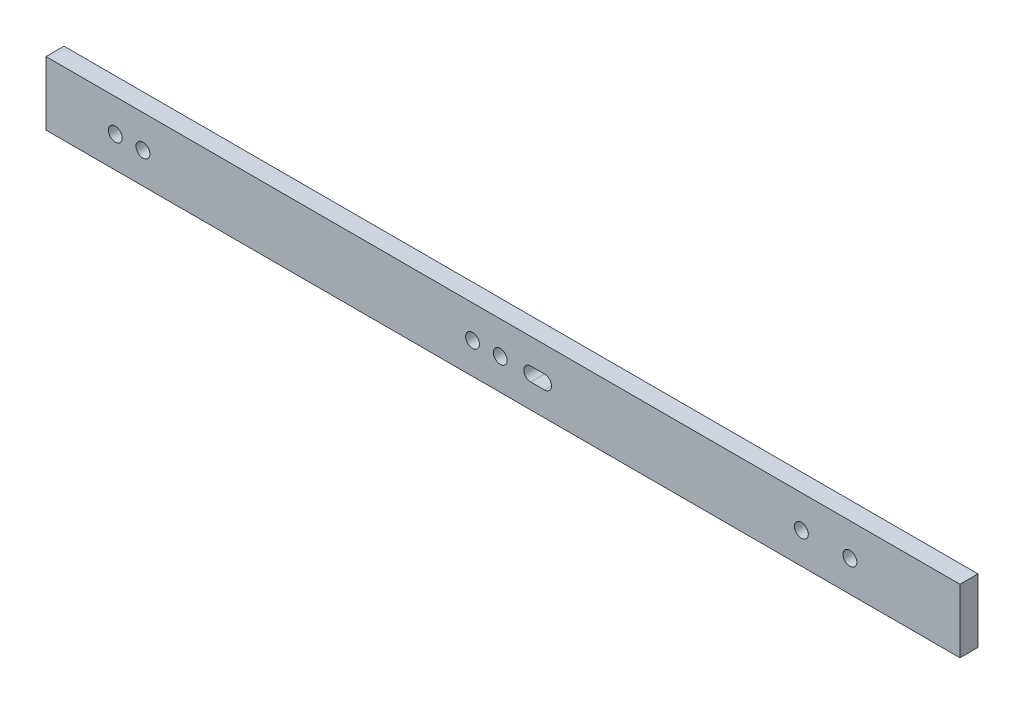
ISO-10303-21;
HEADER;
FILE_DESCRIPTION(('STEP AP214'),'2;1');
FILE_NAME('part.step','',(''),(''),'','','');
FILE_SCHEMA(('AUTOMOTIVE_DESIGN { 1 0 10303 214 1 1 1 1 }'));
ENDSEC;
DATA;
#1=APPLICATION_CONTEXT('core data for automotive mechanical design processes');
#2=APPLICATION_PROTOCOL_DEFINITION('international standard','automotive_design',2000,#1);
#3=PRODUCT_CONTEXT('',#1,'mechanical');
#4=PRODUCT('Part','Part','',(#3));
#5=PRODUCT_RELATED_PRODUCT_CATEGORY('part','',(#4));
#6=PRODUCT_DEFINITION_FORMATION('','',#4);
#7=PRODUCT_DEFINITION_CONTEXT('part definition',#1,'design');
#8=PRODUCT_DEFINITION('design','',#6,#7);
#9=PRODUCT_DEFINITION_SHAPE('','',#8);
#10=(LENGTH_UNIT() NAMED_UNIT(*) SI_UNIT(.MILLI.,.METRE.));
#11=(NAMED_UNIT(*) PLANE_ANGLE_UNIT() SI_UNIT($,.RADIAN.));
#12=(NAMED_UNIT(*) SI_UNIT($,.STERADIAN.) SOLID_ANGLE_UNIT());
#13=UNCERTAINTY_MEASURE_WITH_UNIT(LENGTH_MEASURE(1.E-05),#10,'distance_accuracy_value','');
#14=(GEOMETRIC_REPRESENTATION_CONTEXT(3) GLOBAL_UNCERTAINTY_ASSIGNED_CONTEXT((#13)) GLOBAL_UNIT_ASSIGNED_CONTEXT((#10,
#11,#12)) REPRESENTATION_CONTEXT('',''));
#15=CARTESIAN_POINT('',(0.,0.,0.));
#16=DIRECTION('',(0.,0.,1.));
#17=DIRECTION('',(1.,0.,0.));
#18=AXIS2_PLACEMENT_3D('',#15,#16,#17);
#19=CARTESIAN_POINT('',(330.,0.,0.));
#20=DIRECTION('',(1.,0.,0.));
#21=DIRECTION('',(0.,0.,-1.));
#22=AXIS2_PLACEMENT_3D('',#19,#20,#21);
#23=PLANE('',#22);
#24=DIRECTION('',(0.,1.,0.));
#25=VECTOR('',#24,1.);
#26=CARTESIAN_POINT('',(330.,0.,6.5));
#27=LINE('',#26,#25);
#28=CARTESIAN_POINT('',(330.,0.,6.5));
#29=VERTEX_POINT('',#28);
#30=CARTESIAN_POINT('',(330.,23.,6.5));
#31=VERTEX_POINT('',#30);
#32=EDGE_CURVE('E162',#29,#31,#27,.T.);
#33=ORIENTED_EDGE('',*,*,#32,.F.);
#34=DIRECTION('',(0.,0.,1.));
#35=VECTOR('',#34,1.);
#36=CARTESIAN_POINT('',(330.,0.,0.));
#37=LINE('',#36,#35);
#38=CARTESIAN_POINT('',(330.,0.,0.));
#39=VERTEX_POINT('',#38);
#40=EDGE_CURVE('E11',#39,#29,#37,.T.);
#41=ORIENTED_EDGE('',*,*,#40,.F.);
#42=DIRECTION('',(0.,1.,0.));
#43=VECTOR('',#42,1.);
#44=CARTESIAN_POINT('',(330.,0.,0.));
#45=LINE('',#44,#43);
#46=CARTESIAN_POINT('',(330.,23.,0.));
#47=VERTEX_POINT('',#46);
#48=EDGE_CURVE('E165',#39,#47,#45,.T.);
#49=ORIENTED_EDGE('',*,*,#48,.T.);
#50=DIRECTION('',(0.,0.,1.));
#51=VECTOR('',#50,1.);
#52=CARTESIAN_POINT('',(330.,23.,0.));
#53=LINE('',#52,#51);
#54=EDGE_CURVE('E38',#47,#31,#53,.T.);
#55=ORIENTED_EDGE('',*,*,#54,.T.);
#56=EDGE_LOOP('',(#33,#41,#49,#55));
#57=FACE_BOUND('',#56,.T.);
#58=ADVANCED_FACE('F35',(#57),#23,.T.);
#59=CARTESIAN_POINT('',(0.,0.,0.));
#60=DIRECTION('',(0.,-1.,0.));
#61=DIRECTION('',(0.,0.,-1.));
#62=AXIS2_PLACEMENT_3D('',#59,#60,#61);
#63=PLANE('',#62);
#64=DIRECTION('',(1.,0.,0.));
#65=VECTOR('',#64,1.);
#66=CARTESIAN_POINT('',(0.,0.,6.5));
#67=LINE('',#66,#65);
#68=CARTESIAN_POINT('',(0.,0.,6.5));
#69=VERTEX_POINT('',#68);
#70=EDGE_CURVE('E169',#69,#29,#67,.T.);
#71=ORIENTED_EDGE('',*,*,#70,.F.);
#72=DIRECTION('',(0.,0.,1.));
#73=VECTOR('',#72,1.);
#74=CARTESIAN_POINT('',(0.,0.,0.));
#75=LINE('',#74,#73);
#76=CARTESIAN_POINT('',(0.,0.,0.));
#77=VERTEX_POINT('',#76);
#78=EDGE_CURVE('E43',#77,#69,#75,.T.);
#79=ORIENTED_EDGE('',*,*,#78,.F.);
#80=DIRECTION('',(1.,0.,0.));
#81=VECTOR('',#80,1.);
#82=CARTESIAN_POINT('',(0.,0.,0.));
#83=LINE('',#82,#81);
#84=EDGE_CURVE('E175',#77,#39,#83,.T.);
#85=ORIENTED_EDGE('',*,*,#84,.T.);
#86=ORIENTED_EDGE('',*,*,#40,.T.);
#87=EDGE_LOOP('',(#71,#79,#85,#86));
#88=FACE_BOUND('',#87,.T.);
#89=ADVANCED_FACE('F201',(#88),#63,.T.);
#90=CARTESIAN_POINT('',(0.,23.,0.));
#91=DIRECTION('',(-1.,0.,0.));
#92=DIRECTION('',(0.,0.,1.));
#93=AXIS2_PLACEMENT_3D('',#90,#91,#92);
#94=PLANE('',#93);
#95=DIRECTION('',(0.,-1.,0.));
#96=VECTOR('',#95,1.);
#97=CARTESIAN_POINT('',(0.,23.,6.5));
#98=LINE('',#97,#96);
#99=CARTESIAN_POINT('',(0.,23.,6.5));
#100=VERTEX_POINT('',#99);
#101=EDGE_CURVE('E183',#100,#69,#98,.T.);
#102=ORIENTED_EDGE('',*,*,#101,.F.);
#103=DIRECTION('',(0.,0.,1.));
#104=VECTOR('',#103,1.);
#105=CARTESIAN_POINT('',(0.,23.,0.));
#106=LINE('',#105,#104);
#107=CARTESIAN_POINT('',(0.,23.,0.));
#108=VERTEX_POINT('',#107);
#109=EDGE_CURVE('E188',#108,#100,#106,.T.);
#110=ORIENTED_EDGE('',*,*,#109,.F.);
#111=DIRECTION('',(0.,-1.,0.));
#112=VECTOR('',#111,1.);
#113=CARTESIAN_POINT('',(0.,23.,0.));
#114=LINE('',#113,#112);
#115=EDGE_CURVE('E172',#108,#77,#114,.T.);
#116=ORIENTED_EDGE('',*,*,#115,.T.);
#117=ORIENTED_EDGE('',*,*,#78,.T.);
#118=EDGE_LOOP('',(#102,#110,#116,#117));
#119=FACE_BOUND('',#118,.T.);
#120=ADVANCED_FACE('F206',(#119),#94,.T.);
#121=CARTESIAN_POINT('',(330.,23.,0.));
#122=DIRECTION('',(0.,1.,0.));
#123=DIRECTION('',(0.,0.,1.));
#124=AXIS2_PLACEMENT_3D('',#121,#122,#123);
#125=PLANE('',#124);
#126=DIRECTION('',(-1.,0.,0.));
#127=VECTOR('',#126,1.);
#128=CARTESIAN_POINT('',(330.,23.,6.5));
#129=LINE('',#128,#127);
#130=EDGE_CURVE('E180',#31,#100,#129,.T.);
#131=ORIENTED_EDGE('',*,*,#130,.F.);
#132=ORIENTED_EDGE('',*,*,#54,.F.);
#133=DIRECTION('',(-1.,0.,0.));
#134=VECTOR('',#133,1.);
#135=CARTESIAN_POINT('',(330.,23.,0.));
#136=LINE('',#135,#134);
#137=EDGE_CURVE('E168',#47,#108,#136,.T.);
#138=ORIENTED_EDGE('',*,*,#137,.T.);
#139=ORIENTED_EDGE('',*,*,#109,.T.);
#140=EDGE_LOOP('',(#131,#132,#138,#139));
#141=FACE_BOUND('',#140,.T.);
#142=ADVANCED_FACE('F196',(#141),#125,.T.);
#143=CARTESIAN_POINT('',(0.,0.,0.));
#144=DIRECTION('',(0.,0.,1.));
#145=DIRECTION('',(1.,0.,0.));
#146=AXIS2_PLACEMENT_3D('',#143,#144,#145);
#147=PLANE('',#146);
#148=CARTESIAN_POINT('',(290.250244,11.25,0.));
#149=DIRECTION('',(0.,0.,1.));
#150=DIRECTION('',(-1.,0.,0.));
#151=AXIS2_PLACEMENT_3D('',#148,#149,#150);
#152=CIRCLE('',#151,2.5);
#153=CARTESIAN_POINT('',(287.750244,11.25,0.));
#154=VERTEX_POINT('',#153);
#155=EDGE_CURVE('E351',#154,#154,#152,.T.);
#156=ORIENTED_EDGE('',*,*,#155,.T.);
#157=EDGE_LOOP('',(#156));
#158=FACE_BOUND('',#157,.T.);
#159=CARTESIAN_POINT('',(272.722137,11.25,0.));
#160=DIRECTION('',(0.,0.,1.));
#161=DIRECTION('',(-1.,0.,0.));
#162=AXIS2_PLACEMENT_3D('',#159,#160,#161);
#163=CIRCLE('',#162,2.5);
#164=CARTESIAN_POINT('',(270.222137,11.25,0.));
#165=VERTEX_POINT('',#164);
#166=EDGE_CURVE('E131',#165,#165,#163,.T.);
#167=ORIENTED_EDGE('',*,*,#166,.T.);
#168=EDGE_LOOP('',(#167));
#169=FACE_BOUND('',#168,.T.);
#170=DIRECTION('',(1.,0.,0.));
#171=VECTOR('',#170,1.);
#172=CARTESIAN_POINT('',(180.,8.75,0.));
#173=LINE('',#172,#171);
#174=CARTESIAN_POINT('',(175.,8.75,0.));
#175=VERTEX_POINT('',#174);
#176=CARTESIAN_POINT('',(180.,8.75,0.));
#177=VERTEX_POINT('',#176);
#178=EDGE_CURVE('E108',#175,#177,#173,.T.);
#179=ORIENTED_EDGE('',*,*,#178,.T.);
#180=CARTESIAN_POINT('',(180.,11.25,0.));
#181=DIRECTION('',(0.,0.,1.));
#182=DIRECTION('',(-1.,0.,0.));
#183=AXIS2_PLACEMENT_3D('',#180,#181,#182);
#184=CIRCLE('',#183,2.49999999999999);
#185=CARTESIAN_POINT('',(180.,13.75,0.));
#186=VERTEX_POINT('',#185);
#187=EDGE_CURVE('E102',#177,#186,#184,.T.);
#188=ORIENTED_EDGE('',*,*,#187,.T.);
#189=DIRECTION('',(-1.,0.,0.));
#190=VECTOR('',#189,1.);
#191=CARTESIAN_POINT('',(175.,13.75,0.));
#192=LINE('',#191,#190);
#193=CARTESIAN_POINT('',(175.,13.75,0.));
#194=VERTEX_POINT('',#193);
#195=EDGE_CURVE('E111',#186,#194,#192,.T.);
#196=ORIENTED_EDGE('',*,*,#195,.T.);
#197=CARTESIAN_POINT('',(175.,11.25,0.));
#198=DIRECTION('',(0.,0.,1.));
#199=DIRECTION('',(-1.,0.,0.));
#200=AXIS2_PLACEMENT_3D('',#197,#198,#199);
#201=CIRCLE('',#200,2.5);
#202=EDGE_CURVE('E51',#194,#175,#201,.T.);
#203=ORIENTED_EDGE('',*,*,#202,.T.);
#204=EDGE_LOOP('',(#179,#188,#196,#203));
#205=FACE_BOUND('',#204,.T.);
#206=CARTESIAN_POINT('',(154.,11.25,0.));
#207=DIRECTION('',(0.,0.,1.));
#208=DIRECTION('',(-1.,0.,0.));
#209=AXIS2_PLACEMENT_3D('',#206,#207,#208);
#210=CIRCLE('',#209,2.5);
#211=CARTESIAN_POINT('',(151.5,11.25,0.));
#212=VERTEX_POINT('',#211);
#213=EDGE_CURVE('E141',#212,#212,#210,.T.);
#214=ORIENTED_EDGE('',*,*,#213,.T.);
#215=EDGE_LOOP('',(#214));
#216=FACE_BOUND('',#215,.T.);
#217=CARTESIAN_POINT('',(164.,11.25,0.));
#218=DIRECTION('',(0.,0.,1.));
#219=DIRECTION('',(-1.,0.,0.));
#220=AXIS2_PLACEMENT_3D('',#217,#218,#219);
#221=CIRCLE('',#220,2.5);
#222=CARTESIAN_POINT('',(161.5,11.25,0.));
#223=VERTEX_POINT('',#222);
#224=EDGE_CURVE('E147',#223,#223,#221,.T.);
#225=ORIENTED_EDGE('',*,*,#224,.T.);
#226=EDGE_LOOP('',(#225));
#227=FACE_BOUND('',#226,.T.);
#228=CARTESIAN_POINT('',(25.,11.25,0.));
#229=DIRECTION('',(0.,0.,1.));
#230=DIRECTION('',(-1.,0.,0.));
#231=AXIS2_PLACEMENT_3D('',#228,#229,#230);
#232=CIRCLE('',#231,2.5);
#233=CARTESIAN_POINT('',(22.5,11.25,0.));
#234=VERTEX_POINT('',#233);
#235=EDGE_CURVE('E153',#234,#234,#232,.T.);
#236=ORIENTED_EDGE('',*,*,#235,.T.);
#237=EDGE_LOOP('',(#236));
#238=FACE_BOUND('',#237,.T.);
#239=CARTESIAN_POINT('',(35.,11.25,0.));
#240=DIRECTION('',(0.,0.,1.));
#241=DIRECTION('',(-1.,0.,0.));
#242=AXIS2_PLACEMENT_3D('',#239,#240,#241);
#243=CIRCLE('',#242,2.5);
#244=CARTESIAN_POINT('',(32.5,11.25,0.));
#245=VERTEX_POINT('',#244);
#246=EDGE_CURVE('E159',#245,#245,#243,.T.);
#247=ORIENTED_EDGE('',*,*,#246,.T.);
#248=EDGE_LOOP('',(#247));
#249=FACE_BOUND('',#248,.T.);
#250=ORIENTED_EDGE('',*,*,#48,.F.);
#251=ORIENTED_EDGE('',*,*,#84,.F.);
#252=ORIENTED_EDGE('',*,*,#115,.F.);
#253=ORIENTED_EDGE('',*,*,#137,.F.);
#254=EDGE_LOOP('',(#250,#251,#252,#253));
#255=FACE_BOUND('',#254,.T.);
#256=ADVANCED_FACE('F115',(#158,#169,#205,#216,#227,#238,#249,#255),#147,.F.);
#257=CARTESIAN_POINT('',(0.,0.,6.5));
#258=DIRECTION('',(0.,0.,1.));
#259=DIRECTION('',(1.,0.,0.));
#260=AXIS2_PLACEMENT_3D('',#257,#258,#259);
#261=PLANE('',#260);
#262=CARTESIAN_POINT('',(290.250244,11.25,6.5));
#263=DIRECTION('',(0.,0.,1.));
#264=DIRECTION('',(-1.,0.,0.));
#265=AXIS2_PLACEMENT_3D('',#262,#263,#264);
#266=CIRCLE('',#265,2.5);
#267=CARTESIAN_POINT('',(287.750244,11.25,6.5));
#268=VERTEX_POINT('',#267);
#269=EDGE_CURVE('E354',#268,#268,#266,.T.);
#270=ORIENTED_EDGE('',*,*,#269,.F.);
#271=EDGE_LOOP('',(#270));
#272=FACE_BOUND('',#271,.T.);
#273=CARTESIAN_POINT('',(272.722137,11.25,6.5));
#274=DIRECTION('',(0.,0.,1.));
#275=DIRECTION('',(-1.,0.,0.));
#276=AXIS2_PLACEMENT_3D('',#273,#274,#275);
#277=CIRCLE('',#276,2.5);
#278=CARTESIAN_POINT('',(270.222137,11.25,6.5));
#279=VERTEX_POINT('',#278);
#280=EDGE_CURVE('E124',#279,#279,#277,.T.);
#281=ORIENTED_EDGE('',*,*,#280,.F.);
#282=EDGE_LOOP('',(#281));
#283=FACE_BOUND('',#282,.T.);
#284=CARTESIAN_POINT('',(180.,11.25,6.5));
#285=DIRECTION('',(0.,0.,1.));
#286=DIRECTION('',(-1.,0.,0.));
#287=AXIS2_PLACEMENT_3D('',#284,#285,#286);
#288=CIRCLE('',#287,2.49999999999999);
#289=CARTESIAN_POINT('',(180.,8.75,6.5));
#290=VERTEX_POINT('',#289);
#291=CARTESIAN_POINT('',(180.,13.75,6.5));
#292=VERTEX_POINT('',#291);
#293=EDGE_CURVE('E59',#290,#292,#288,.T.);
#294=ORIENTED_EDGE('',*,*,#293,.F.);
#295=DIRECTION('',(1.,0.,0.));
#296=VECTOR('',#295,1.);
#297=CARTESIAN_POINT('',(180.,8.75,6.5));
#298=LINE('',#297,#296);
#299=CARTESIAN_POINT('',(175.,8.75,6.5));
#300=VERTEX_POINT('',#299);
#301=EDGE_CURVE('E118',#300,#290,#298,.T.);
#302=ORIENTED_EDGE('',*,*,#301,.F.);
#303=CARTESIAN_POINT('',(175.,11.25,6.5));
#304=DIRECTION('',(0.,0.,1.));
#305=DIRECTION('',(-1.,0.,0.));
#306=AXIS2_PLACEMENT_3D('',#303,#304,#305);
#307=CIRCLE('',#306,2.5);
#308=CARTESIAN_POINT('',(175.,13.75,6.5));
#309=VERTEX_POINT('',#308);
#310=EDGE_CURVE('E121',#309,#300,#307,.T.);
#311=ORIENTED_EDGE('',*,*,#310,.F.);
#312=DIRECTION('',(-1.,0.,0.));
#313=VECTOR('',#312,1.);
#314=CARTESIAN_POINT('',(175.,13.75,6.5));
#315=LINE('',#314,#313);
#316=EDGE_CURVE('E130',#292,#309,#315,.T.);
#317=ORIENTED_EDGE('',*,*,#316,.F.);
#318=EDGE_LOOP('',(#294,#302,#311,#317));
#319=FACE_BOUND('',#318,.T.);
#320=CARTESIAN_POINT('',(154.,11.25,6.5));
#321=DIRECTION('',(0.,0.,1.));
#322=DIRECTION('',(-1.,0.,0.));
#323=AXIS2_PLACEMENT_3D('',#320,#321,#322);
#324=CIRCLE('',#323,2.5);
#325=CARTESIAN_POINT('',(151.5,11.25,6.5));
#326=VERTEX_POINT('',#325);
#327=EDGE_CURVE('E137',#326,#326,#324,.T.);
#328=ORIENTED_EDGE('',*,*,#327,.F.);
#329=EDGE_LOOP('',(#328));
#330=FACE_BOUND('',#329,.T.);
#331=CARTESIAN_POINT('',(164.,11.25,6.5));
#332=DIRECTION('',(0.,0.,1.));
#333=DIRECTION('',(-1.,0.,0.));
#334=AXIS2_PLACEMENT_3D('',#331,#332,#333);
#335=CIRCLE('',#334,2.5);
#336=CARTESIAN_POINT('',(161.5,11.25,6.5));
#337=VERTEX_POINT('',#336);
#338=EDGE_CURVE('E144',#337,#337,#335,.T.);
#339=ORIENTED_EDGE('',*,*,#338,.F.);
#340=EDGE_LOOP('',(#339));
#341=FACE_BOUND('',#340,.T.);
#342=CARTESIAN_POINT('',(25.,11.25,6.5));
#343=DIRECTION('',(0.,0.,1.));
#344=DIRECTION('',(-1.,0.,0.));
#345=AXIS2_PLACEMENT_3D('',#342,#343,#344);
#346=CIRCLE('',#345,2.5);
#347=CARTESIAN_POINT('',(22.5,11.25,6.5));
#348=VERTEX_POINT('',#347);
#349=EDGE_CURVE('E150',#348,#348,#346,.T.);
#350=ORIENTED_EDGE('',*,*,#349,.F.);
#351=EDGE_LOOP('',(#350));
#352=FACE_BOUND('',#351,.T.);
#353=CARTESIAN_POINT('',(35.,11.25,6.5));
#354=DIRECTION('',(0.,0.,1.));
#355=DIRECTION('',(-1.,0.,0.));
#356=AXIS2_PLACEMENT_3D('',#353,#354,#355);
#357=CIRCLE('',#356,2.5);
#358=CARTESIAN_POINT('',(32.5,11.25,6.5));
#359=VERTEX_POINT('',#358);
#360=EDGE_CURVE('E156',#359,#359,#357,.T.);
#361=ORIENTED_EDGE('',*,*,#360,.F.);
#362=EDGE_LOOP('',(#361));
#363=FACE_BOUND('',#362,.T.);
#364=ORIENTED_EDGE('',*,*,#32,.T.);
#365=ORIENTED_EDGE('',*,*,#130,.T.);
#366=ORIENTED_EDGE('',*,*,#101,.T.);
#367=ORIENTED_EDGE('',*,*,#70,.T.);
#368=EDGE_LOOP('',(#364,#365,#366,#367));
#369=FACE_BOUND('',#368,.T.);
#370=ADVANCED_FACE('F198',(#272,#283,#319,#330,#341,#352,#363,#369),#261,.T.);
#371=CARTESIAN_POINT('',(35.,11.25,0.));
#372=DIRECTION('',(0.,0.,1.));
#373=DIRECTION('',(1.,0.,0.));
#374=AXIS2_PLACEMENT_3D('',#371,#372,#373);
#375=CYLINDRICAL_SURFACE('',#374,2.5);
#376=ORIENTED_EDGE('',*,*,#246,.F.);
#377=EDGE_LOOP('',(#376));
#378=FACE_BOUND('',#377,.T.);
#379=ORIENTED_EDGE('',*,*,#360,.T.);
#380=EDGE_LOOP('',(#379));
#381=FACE_BOUND('',#380,.T.);
#382=ADVANCED_FACE('F249',(#378,#381),#375,.F.);
#383=CARTESIAN_POINT('',(25.,11.25,0.));
#384=DIRECTION('',(0.,0.,1.));
#385=DIRECTION('',(1.,0.,0.));
#386=AXIS2_PLACEMENT_3D('',#383,#384,#385);
#387=CYLINDRICAL_SURFACE('',#386,2.5);
#388=ORIENTED_EDGE('',*,*,#235,.F.);
#389=EDGE_LOOP('',(#388));
#390=FACE_BOUND('',#389,.T.);
#391=ORIENTED_EDGE('',*,*,#349,.T.);
#392=EDGE_LOOP('',(#391));
#393=FACE_BOUND('',#392,.T.);
#394=ADVANCED_FACE('F259',(#390,#393),#387,.F.);
#395=CARTESIAN_POINT('',(164.,11.25,0.));
#396=DIRECTION('',(0.,0.,1.));
#397=DIRECTION('',(1.,0.,0.));
#398=AXIS2_PLACEMENT_3D('',#395,#396,#397);
#399=CYLINDRICAL_SURFACE('',#398,2.5);
#400=ORIENTED_EDGE('',*,*,#224,.F.);
#401=EDGE_LOOP('',(#400));
#402=FACE_BOUND('',#401,.T.);
#403=ORIENTED_EDGE('',*,*,#338,.T.);
#404=EDGE_LOOP('',(#403));
#405=FACE_BOUND('',#404,.T.);
#406=ADVANCED_FACE('F269',(#402,#405),#399,.F.);
#407=CARTESIAN_POINT('',(154.,11.25,0.));
#408=DIRECTION('',(0.,0.,1.));
#409=DIRECTION('',(1.,0.,0.));
#410=AXIS2_PLACEMENT_3D('',#407,#408,#409);
#411=CYLINDRICAL_SURFACE('',#410,2.5);
#412=ORIENTED_EDGE('',*,*,#213,.F.);
#413=EDGE_LOOP('',(#412));
#414=FACE_BOUND('',#413,.T.);
#415=ORIENTED_EDGE('',*,*,#327,.T.);
#416=EDGE_LOOP('',(#415));
#417=FACE_BOUND('',#416,.T.);
#418=ADVANCED_FACE('F279',(#414,#417),#411,.F.);
#419=CARTESIAN_POINT('',(180.,11.25,0.));
#420=DIRECTION('',(0.,0.,1.));
#421=DIRECTION('',(1.,0.,0.));
#422=AXIS2_PLACEMENT_3D('',#419,#420,#421);
#423=CYLINDRICAL_SURFACE('',#422,2.49999999999999);
#424=ORIENTED_EDGE('',*,*,#293,.T.);
#425=DIRECTION('',(0.,0.,1.));
#426=VECTOR('',#425,1.);
#427=CARTESIAN_POINT('',(180.,13.75,0.));
#428=LINE('',#427,#426);
#429=EDGE_CURVE('E98',#186,#292,#428,.T.);
#430=ORIENTED_EDGE('',*,*,#429,.F.);
#431=ORIENTED_EDGE('',*,*,#187,.F.);
#432=DIRECTION('',(0.,0.,1.));
#433=VECTOR('',#432,1.);
#434=CARTESIAN_POINT('',(180.,8.75,0.));
#435=LINE('',#434,#433);
#436=EDGE_CURVE('E135',#177,#290,#435,.T.);
#437=ORIENTED_EDGE('',*,*,#436,.T.);
#438=EDGE_LOOP('',(#424,#430,#431,#437));
#439=FACE_BOUND('',#438,.T.);
#440=ADVANCED_FACE('F100',(#439),#423,.F.);
#441=CARTESIAN_POINT('',(180.,8.75,0.));
#442=DIRECTION('',(0.,-1.,0.));
#443=DIRECTION('',(0.,0.,-1.));
#444=AXIS2_PLACEMENT_3D('',#441,#442,#443);
#445=PLANE('',#444);
#446=ORIENTED_EDGE('',*,*,#301,.T.);
#447=ORIENTED_EDGE('',*,*,#436,.F.);
#448=ORIENTED_EDGE('',*,*,#178,.F.);
#449=DIRECTION('',(0.,0.,1.));
#450=VECTOR('',#449,1.);
#451=CARTESIAN_POINT('',(175.,8.75,0.));
#452=LINE('',#451,#450);
#453=EDGE_CURVE('E138',#175,#300,#452,.T.);
#454=ORIENTED_EDGE('',*,*,#453,.T.);
#455=EDGE_LOOP('',(#446,#447,#448,#454));
#456=FACE_BOUND('',#455,.T.);
#457=ADVANCED_FACE('F298',(#456),#445,.F.);
#458=CARTESIAN_POINT('',(175.,11.25,0.));
#459=DIRECTION('',(0.,0.,1.));
#460=DIRECTION('',(1.,0.,0.));
#461=AXIS2_PLACEMENT_3D('',#458,#459,#460);
#462=CYLINDRICAL_SURFACE('',#461,2.5);
#463=ORIENTED_EDGE('',*,*,#310,.T.);
#464=ORIENTED_EDGE('',*,*,#453,.F.);
#465=ORIENTED_EDGE('',*,*,#202,.F.);
#466=DIRECTION('',(0.,0.,1.));
#467=VECTOR('',#466,1.);
#468=CARTESIAN_POINT('',(175.,13.75,0.));
#469=LINE('',#468,#467);
#470=EDGE_CURVE('E107',#194,#309,#469,.T.);
#471=ORIENTED_EDGE('',*,*,#470,.T.);
#472=EDGE_LOOP('',(#463,#464,#465,#471));
#473=FACE_BOUND('',#472,.T.);
#474=ADVANCED_FACE('F307',(#473),#462,.F.);
#475=CARTESIAN_POINT('',(175.,13.75,0.));
#476=DIRECTION('',(0.,1.,0.));
#477=DIRECTION('',(-1.,0.,0.));
#478=AXIS2_PLACEMENT_3D('',#475,#476,#477);
#479=PLANE('',#478);
#480=ORIENTED_EDGE('',*,*,#316,.T.);
#481=ORIENTED_EDGE('',*,*,#470,.F.);
#482=ORIENTED_EDGE('',*,*,#195,.F.);
#483=ORIENTED_EDGE('',*,*,#429,.T.);
#484=EDGE_LOOP('',(#480,#481,#482,#483));
#485=FACE_BOUND('',#484,.T.);
#486=ADVANCED_FACE('F112',(#485),#479,.F.);
#487=CARTESIAN_POINT('',(272.722137,11.25,0.));
#488=DIRECTION('',(0.,0.,1.));
#489=DIRECTION('',(1.,0.,0.));
#490=AXIS2_PLACEMENT_3D('',#487,#488,#489);
#491=CYLINDRICAL_SURFACE('',#490,2.5);
#492=ORIENTED_EDGE('',*,*,#166,.F.);
#493=EDGE_LOOP('',(#492));
#494=FACE_BOUND('',#493,.T.);
#495=ORIENTED_EDGE('',*,*,#280,.T.);
#496=EDGE_LOOP('',(#495));
#497=FACE_BOUND('',#496,.T.);
#498=ADVANCED_FACE('F325',(#494,#497),#491,.F.);
#499=CARTESIAN_POINT('',(290.250244,11.25,0.));
#500=DIRECTION('',(0.,0.,1.));
#501=DIRECTION('',(1.,0.,0.));
#502=AXIS2_PLACEMENT_3D('',#499,#500,#501);
#503=CYLINDRICAL_SURFACE('',#502,2.5);
#504=ORIENTED_EDGE('',*,*,#155,.F.);
#505=EDGE_LOOP('',(#504));
#506=FACE_BOUND('',#505,.T.);
#507=ORIENTED_EDGE('',*,*,#269,.T.);
#508=EDGE_LOOP('',(#507));
#509=FACE_BOUND('',#508,.T.);
#510=ADVANCED_FACE('F334',(#506,#509),#503,.F.);
#511=CLOSED_SHELL('',(#58,#89,#120,#142,#256,#370,#382,#394,#406,#418,#440,#457,#474,#486,#498,#510));
#512=MANIFOLD_SOLID_BREP('B2',#511);
#513=ADVANCED_BREP_SHAPE_REPRESENTATION('',(#18,#512),#14);
#514=SHAPE_DEFINITION_REPRESENTATION(#9,#513);
ENDSEC;
END-ISO-10303-21;
